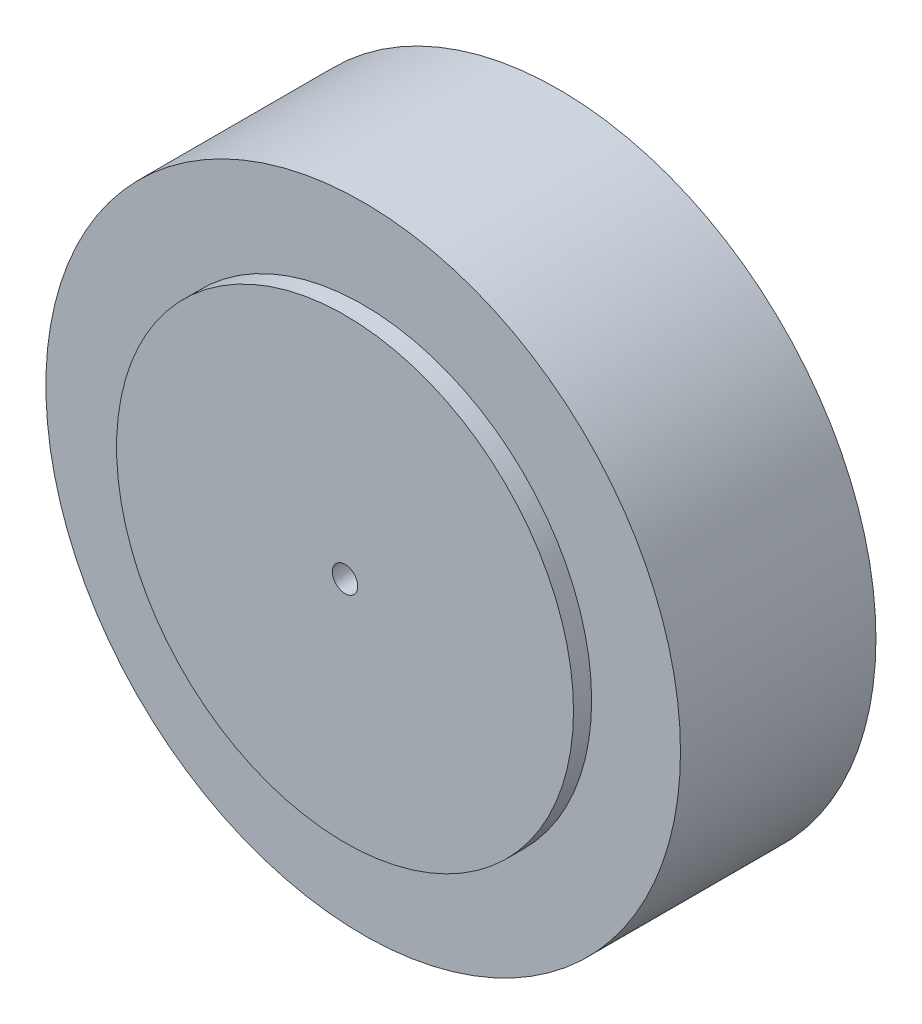
ISO-10303-21;
HEADER;
FILE_DESCRIPTION(('STEP AP214'),'2;1');
FILE_NAME('part.step','',(''),(''),'','','');
FILE_SCHEMA(('AUTOMOTIVE_DESIGN { 1 0 10303 214 1 1 1 1 }'));
ENDSEC;
DATA;
#1=APPLICATION_CONTEXT('core data for automotive mechanical design processes');
#2=APPLICATION_PROTOCOL_DEFINITION('international standard','automotive_design',2000,#1);
#3=PRODUCT_CONTEXT('',#1,'mechanical');
#4=PRODUCT('Part','Part','',(#3));
#5=PRODUCT_RELATED_PRODUCT_CATEGORY('part','',(#4));
#6=PRODUCT_DEFINITION_FORMATION('','',#4);
#7=PRODUCT_DEFINITION_CONTEXT('part definition',#1,'design');
#8=PRODUCT_DEFINITION('design','',#6,#7);
#9=PRODUCT_DEFINITION_SHAPE('','',#8);
#10=(LENGTH_UNIT() NAMED_UNIT(*) SI_UNIT(.MILLI.,.METRE.));
#11=(NAMED_UNIT(*) PLANE_ANGLE_UNIT() SI_UNIT($,.RADIAN.));
#12=(NAMED_UNIT(*) SI_UNIT($,.STERADIAN.) SOLID_ANGLE_UNIT());
#13=UNCERTAINTY_MEASURE_WITH_UNIT(LENGTH_MEASURE(1.E-05),#10,'distance_accuracy_value','');
#14=(GEOMETRIC_REPRESENTATION_CONTEXT(3) GLOBAL_UNCERTAINTY_ASSIGNED_CONTEXT((#13)) GLOBAL_UNIT_ASSIGNED_CONTEXT((#10,
#11,#12)) REPRESENTATION_CONTEXT('',''));
#15=CARTESIAN_POINT('',(0.,0.,0.));
#16=DIRECTION('',(0.,0.,1.));
#17=DIRECTION('',(1.,0.,0.));
#18=AXIS2_PLACEMENT_3D('',#15,#16,#17);
#19=CARTESIAN_POINT('',(0.,0.,19.558));
#20=DIRECTION('',(0.,0.,1.));
#21=DIRECTION('',(1.,0.,0.));
#22=AXIS2_PLACEMENT_3D('',#19,#20,#21);
#23=PLANE('',#22);
#24=CARTESIAN_POINT('',(0.,0.,19.558));
#25=DIRECTION('',(0.,0.,1.));
#26=DIRECTION('',(1.,0.,0.));
#27=AXIS2_PLACEMENT_3D('',#24,#25,#26);
#28=CIRCLE('',#27,22.86);
#29=CARTESIAN_POINT('',(22.86,0.,19.558));
#30=VERTEX_POINT('',#29);
#31=EDGE_CURVE('E10',#30,#30,#28,.T.);
#32=ORIENTED_EDGE('',*,*,#31,.F.);
#33=EDGE_LOOP('',(#32));
#34=FACE_BOUND('',#33,.T.);
#35=CARTESIAN_POINT('',(0.,0.,19.558));
#36=DIRECTION('',(0.,0.,1.));
#37=DIRECTION('',(1.,0.,0.));
#38=AXIS2_PLACEMENT_3D('',#35,#36,#37);
#39=CIRCLE('',#38,31.75);
#40=CARTESIAN_POINT('',(31.75,0.,19.558));
#41=VERTEX_POINT('',#40);
#42=EDGE_CURVE('E41',#41,#41,#39,.T.);
#43=ORIENTED_EDGE('',*,*,#42,.T.);
#44=EDGE_LOOP('',(#43));
#45=FACE_BOUND('',#44,.T.);
#46=ADVANCED_FACE('F33',(#34,#45),#23,.T.);
#47=CARTESIAN_POINT('',(0.,0.,0.));
#48=DIRECTION('',(0.,0.,1.));
#49=DIRECTION('',(1.,0.,0.));
#50=AXIS2_PLACEMENT_3D('',#47,#48,#49);
#51=PLANE('',#50);
#52=CARTESIAN_POINT('',(0.,0.,0.));
#53=DIRECTION('',(0.,0.,1.));
#54=DIRECTION('',(1.,0.,0.));
#55=AXIS2_PLACEMENT_3D('',#52,#53,#54);
#56=CIRCLE('',#55,31.75);
#57=CARTESIAN_POINT('',(31.75,0.,0.));
#58=VERTEX_POINT('',#57);
#59=EDGE_CURVE('E37',#58,#58,#56,.T.);
#60=ORIENTED_EDGE('',*,*,#59,.F.);
#61=EDGE_LOOP('',(#60));
#62=FACE_BOUND('',#61,.T.);
#63=CARTESIAN_POINT('',(0.,0.,0.));
#64=DIRECTION('',(0.,0.,1.));
#65=DIRECTION('',(1.,0.,0.));
#66=AXIS2_PLACEMENT_3D('',#63,#64,#65);
#67=CIRCLE('',#66,1.27);
#68=CARTESIAN_POINT('',(1.27,0.,0.));
#69=VERTEX_POINT('',#68);
#70=EDGE_CURVE('E50',#69,#69,#67,.T.);
#71=ORIENTED_EDGE('',*,*,#70,.T.);
#72=EDGE_LOOP('',(#71));
#73=FACE_BOUND('',#72,.T.);
#74=ADVANCED_FACE('F77',(#62,#73),#51,.F.);
#75=CARTESIAN_POINT('',(0.,0.,19.558));
#76=DIRECTION('',(0.,0.,-1.));
#77=DIRECTION('',(-1.,0.,0.));
#78=AXIS2_PLACEMENT_3D('',#75,#76,#77);
#79=CYLINDRICAL_SURFACE('',#78,31.75);
#80=ORIENTED_EDGE('',*,*,#42,.F.);
#81=EDGE_LOOP('',(#80));
#82=FACE_BOUND('',#81,.T.);
#83=ORIENTED_EDGE('',*,*,#59,.T.);
#84=EDGE_LOOP('',(#83));
#85=FACE_BOUND('',#84,.T.);
#86=ADVANCED_FACE('F35',(#82,#85),#79,.T.);
#87=CARTESIAN_POINT('',(0.,0.,19.558));
#88=DIRECTION('',(0.,0.,-1.));
#89=DIRECTION('',(-1.,0.,0.));
#90=AXIS2_PLACEMENT_3D('',#87,#88,#89);
#91=CYLINDRICAL_SURFACE('',#90,1.27);
#92=ORIENTED_EDGE('',*,*,#70,.F.);
#93=EDGE_LOOP('',(#92));
#94=FACE_BOUND('',#93,.T.);
#95=CARTESIAN_POINT('',(0.,0.,21.3741));
#96=DIRECTION('',(0.,0.,1.));
#97=DIRECTION('',(1.,0.,0.));
#98=AXIS2_PLACEMENT_3D('',#95,#96,#97);
#99=CIRCLE('',#98,1.27);
#100=CARTESIAN_POINT('',(1.27,0.,21.3741));
#101=VERTEX_POINT('',#100);
#102=EDGE_CURVE('E56',#101,#101,#99,.T.);
#103=ORIENTED_EDGE('',*,*,#102,.T.);
#104=EDGE_LOOP('',(#103));
#105=FACE_BOUND('',#104,.T.);
#106=ADVANCED_FACE('F62',(#94,#105),#91,.F.);
#107=CARTESIAN_POINT('',(0.,0.,21.3741));
#108=DIRECTION('',(0.,0.,1.));
#109=DIRECTION('',(1.,0.,0.));
#110=AXIS2_PLACEMENT_3D('',#107,#108,#109);
#111=PLANE('',#110);
#112=CARTESIAN_POINT('',(0.,0.,21.3741));
#113=DIRECTION('',(0.,0.,1.));
#114=DIRECTION('',(1.,0.,0.));
#115=AXIS2_PLACEMENT_3D('',#112,#113,#114);
#116=CIRCLE('',#115,22.86);
#117=CARTESIAN_POINT('',(22.86,0.,21.3741));
#118=VERTEX_POINT('',#117);
#119=EDGE_CURVE('E48',#118,#118,#116,.T.);
#120=ORIENTED_EDGE('',*,*,#119,.T.);
#121=EDGE_LOOP('',(#120));
#122=FACE_BOUND('',#121,.T.);
#123=ORIENTED_EDGE('',*,*,#102,.F.);
#124=EDGE_LOOP('',(#123));
#125=FACE_BOUND('',#124,.T.);
#126=ADVANCED_FACE('F64',(#122,#125),#111,.T.);
#127=CARTESIAN_POINT('',(0.,0.,21.3741));
#128=DIRECTION('',(0.,0.,-1.));
#129=DIRECTION('',(-1.,0.,0.));
#130=AXIS2_PLACEMENT_3D('',#127,#128,#129);
#131=CYLINDRICAL_SURFACE('',#130,22.86);
#132=ORIENTED_EDGE('',*,*,#119,.F.);
#133=EDGE_LOOP('',(#132));
#134=FACE_BOUND('',#133,.T.);
#135=ORIENTED_EDGE('',*,*,#31,.T.);
#136=EDGE_LOOP('',(#135));
#137=FACE_BOUND('',#136,.T.);
#138=ADVANCED_FACE('F66',(#134,#137),#131,.T.);
#139=CLOSED_SHELL('',(#46,#74,#86,#106,#126,#138));
#140=MANIFOLD_SOLID_BREP('B2',#139);
#141=ADVANCED_BREP_SHAPE_REPRESENTATION('',(#18,#140),#14);
#142=SHAPE_DEFINITION_REPRESENTATION(#9,#141);
ENDSEC;
END-ISO-10303-21;
